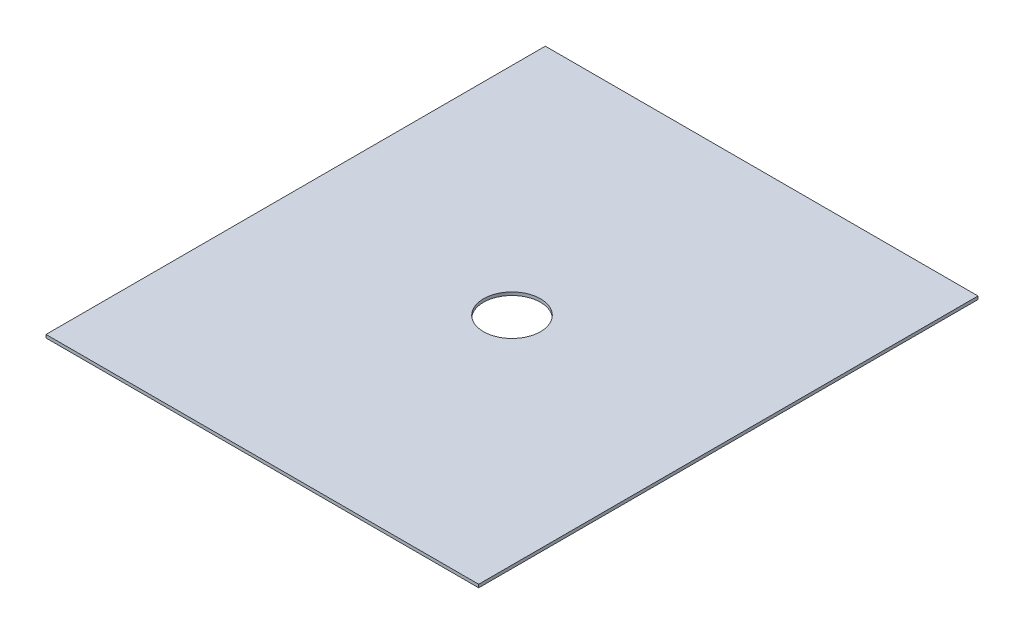
ISO-10303-21;
HEADER;
FILE_DESCRIPTION(('STEP AP214'),'2;1');
FILE_NAME('part.step','',(''),(''),'','','');
FILE_SCHEMA(('AUTOMOTIVE_DESIGN { 1 0 10303 214 1 1 1 1 }'));
ENDSEC;
DATA;
#1=APPLICATION_CONTEXT('core data for automotive mechanical design processes');
#2=APPLICATION_PROTOCOL_DEFINITION('international standard','automotive_design',2000,#1);
#3=PRODUCT_CONTEXT('',#1,'mechanical');
#4=PRODUCT('Part','Part','',(#3));
#5=PRODUCT_RELATED_PRODUCT_CATEGORY('part','',(#4));
#6=PRODUCT_DEFINITION_FORMATION('','',#4);
#7=PRODUCT_DEFINITION_CONTEXT('part definition',#1,'design');
#8=PRODUCT_DEFINITION('design','',#6,#7);
#9=PRODUCT_DEFINITION_SHAPE('','',#8);
#10=(LENGTH_UNIT() NAMED_UNIT(*) SI_UNIT(.MILLI.,.METRE.));
#11=(NAMED_UNIT(*) PLANE_ANGLE_UNIT() SI_UNIT($,.RADIAN.));
#12=(NAMED_UNIT(*) SI_UNIT($,.STERADIAN.) SOLID_ANGLE_UNIT());
#13=UNCERTAINTY_MEASURE_WITH_UNIT(LENGTH_MEASURE(1.E-05),#10,'distance_accuracy_value','');
#14=(GEOMETRIC_REPRESENTATION_CONTEXT(3) GLOBAL_UNCERTAINTY_ASSIGNED_CONTEXT((#13)) GLOBAL_UNIT_ASSIGNED_CONTEXT((#10,
#11,#12)) REPRESENTATION_CONTEXT('',''));
#15=CARTESIAN_POINT('',(0.,0.,0.));
#16=DIRECTION('',(0.,0.,1.));
#17=DIRECTION('',(1.,0.,0.));
#18=AXIS2_PLACEMENT_3D('',#15,#16,#17);
#19=CARTESIAN_POINT('',(138.65,2.,-160.));
#20=DIRECTION('',(-1.,0.,0.));
#21=DIRECTION('',(0.,0.,1.));
#22=AXIS2_PLACEMENT_3D('',#19,#20,#21);
#23=PLANE('',#22);
#24=DIRECTION('',(0.,0.,-1.));
#25=VECTOR('',#24,1.);
#26=CARTESIAN_POINT('',(138.65,0.,-160.));
#27=LINE('',#26,#25);
#28=CARTESIAN_POINT('',(138.65,0.,160.));
#29=VERTEX_POINT('',#28);
#30=CARTESIAN_POINT('',(138.65,0.,-160.));
#31=VERTEX_POINT('',#30);
#32=EDGE_CURVE('E108',#29,#31,#27,.T.);
#33=ORIENTED_EDGE('',*,*,#32,.T.);
#34=DIRECTION('',(0.,-1.,0.));
#35=VECTOR('',#34,1.);
#36=CARTESIAN_POINT('',(138.65,2.,-160.));
#37=LINE('',#36,#35);
#38=CARTESIAN_POINT('',(138.65,2.,-160.));
#39=VERTEX_POINT('',#38);
#40=EDGE_CURVE('E11',#39,#31,#37,.T.);
#41=ORIENTED_EDGE('',*,*,#40,.F.);
#42=DIRECTION('',(0.,0.,-1.));
#43=VECTOR('',#42,1.);
#44=CARTESIAN_POINT('',(138.65,2.,-160.));
#45=LINE('',#44,#43);
#46=CARTESIAN_POINT('',(138.65,2.,160.));
#47=VERTEX_POINT('',#46);
#48=EDGE_CURVE('E91',#47,#39,#45,.T.);
#49=ORIENTED_EDGE('',*,*,#48,.F.);
#50=DIRECTION('',(0.,-1.,0.));
#51=VECTOR('',#50,1.);
#52=CARTESIAN_POINT('',(138.65,2.,160.));
#53=LINE('',#52,#51);
#54=EDGE_CURVE('E104',#47,#29,#53,.T.);
#55=ORIENTED_EDGE('',*,*,#54,.T.);
#56=EDGE_LOOP('',(#33,#41,#49,#55));
#57=FACE_BOUND('',#56,.T.);
#58=ADVANCED_FACE('F38',(#57),#23,.F.);
#59=CARTESIAN_POINT('',(-138.65,2.,-160.));
#60=DIRECTION('',(0.,0.,1.));
#61=DIRECTION('',(1.,0.,0.));
#62=AXIS2_PLACEMENT_3D('',#59,#60,#61);
#63=PLANE('',#62);
#64=DIRECTION('',(-1.,0.,0.));
#65=VECTOR('',#64,1.);
#66=CARTESIAN_POINT('',(-138.65,0.,-160.));
#67=LINE('',#66,#65);
#68=CARTESIAN_POINT('',(-138.65,0.,-160.));
#69=VERTEX_POINT('',#68);
#70=EDGE_CURVE('E96',#31,#69,#67,.T.);
#71=ORIENTED_EDGE('',*,*,#70,.T.);
#72=DIRECTION('',(0.,-1.,0.));
#73=VECTOR('',#72,1.);
#74=CARTESIAN_POINT('',(-138.65,2.,-160.));
#75=LINE('',#74,#73);
#76=CARTESIAN_POINT('',(-138.65,2.,-160.));
#77=VERTEX_POINT('',#76);
#78=EDGE_CURVE('E48',#77,#69,#75,.T.);
#79=ORIENTED_EDGE('',*,*,#78,.F.);
#80=DIRECTION('',(-1.,0.,0.));
#81=VECTOR('',#80,1.);
#82=CARTESIAN_POINT('',(-138.65,2.,-160.));
#83=LINE('',#82,#81);
#84=EDGE_CURVE('E86',#39,#77,#83,.T.);
#85=ORIENTED_EDGE('',*,*,#84,.F.);
#86=ORIENTED_EDGE('',*,*,#40,.T.);
#87=EDGE_LOOP('',(#71,#79,#85,#86));
#88=FACE_BOUND('',#87,.T.);
#89=ADVANCED_FACE('F95',(#88),#63,.F.);
#90=CARTESIAN_POINT('',(-138.65,2.,-160.));
#91=DIRECTION('',(1.,0.,0.));
#92=DIRECTION('',(0.,0.,-1.));
#93=AXIS2_PLACEMENT_3D('',#90,#91,#92);
#94=PLANE('',#93);
#95=DIRECTION('',(0.,0.,1.));
#96=VECTOR('',#95,1.);
#97=CARTESIAN_POINT('',(-138.65,0.,-160.));
#98=LINE('',#97,#96);
#99=CARTESIAN_POINT('',(-138.65,0.,160.));
#100=VERTEX_POINT('',#99);
#101=EDGE_CURVE('E73',#69,#100,#98,.T.);
#102=ORIENTED_EDGE('',*,*,#101,.T.);
#103=DIRECTION('',(0.,-1.,0.));
#104=VECTOR('',#103,1.);
#105=CARTESIAN_POINT('',(-138.65,2.,160.));
#106=LINE('',#105,#104);
#107=CARTESIAN_POINT('',(-138.65,2.,160.));
#108=VERTEX_POINT('',#107);
#109=EDGE_CURVE('E98',#108,#100,#106,.T.);
#110=ORIENTED_EDGE('',*,*,#109,.F.);
#111=DIRECTION('',(0.,0.,1.));
#112=VECTOR('',#111,1.);
#113=CARTESIAN_POINT('',(-138.65,2.,-160.));
#114=LINE('',#113,#112);
#115=EDGE_CURVE('E89',#77,#108,#114,.T.);
#116=ORIENTED_EDGE('',*,*,#115,.F.);
#117=ORIENTED_EDGE('',*,*,#78,.T.);
#118=EDGE_LOOP('',(#102,#110,#116,#117));
#119=FACE_BOUND('',#118,.T.);
#120=ADVANCED_FACE('F100',(#119),#94,.F.);
#121=CARTESIAN_POINT('',(-138.65,2.,160.));
#122=DIRECTION('',(0.,0.,-1.));
#123=DIRECTION('',(-1.,0.,0.));
#124=AXIS2_PLACEMENT_3D('',#121,#122,#123);
#125=PLANE('',#124);
#126=DIRECTION('',(1.,0.,0.));
#127=VECTOR('',#126,1.);
#128=CARTESIAN_POINT('',(-138.65,0.,160.));
#129=LINE('',#128,#127);
#130=EDGE_CURVE('E79',#100,#29,#129,.T.);
#131=ORIENTED_EDGE('',*,*,#130,.T.);
#132=ORIENTED_EDGE('',*,*,#54,.F.);
#133=DIRECTION('',(1.,0.,0.));
#134=VECTOR('',#133,1.);
#135=CARTESIAN_POINT('',(-138.65,2.,160.));
#136=LINE('',#135,#134);
#137=EDGE_CURVE('E56',#108,#47,#136,.T.);
#138=ORIENTED_EDGE('',*,*,#137,.F.);
#139=ORIENTED_EDGE('',*,*,#109,.T.);
#140=EDGE_LOOP('',(#131,#132,#138,#139));
#141=FACE_BOUND('',#140,.T.);
#142=ADVANCED_FACE('F121',(#141),#125,.F.);
#143=CARTESIAN_POINT('',(0.,2.,0.));
#144=DIRECTION('',(0.,1.,0.));
#145=DIRECTION('',(0.,0.,1.));
#146=AXIS2_PLACEMENT_3D('',#143,#144,#145);
#147=PLANE('',#146);
#148=CARTESIAN_POINT('',(0.,2.,0.));
#149=DIRECTION('',(0.,1.,0.));
#150=DIRECTION('',(0.,0.,1.));
#151=AXIS2_PLACEMENT_3D('',#148,#149,#150);
#152=CIRCLE('',#151,18.2814663488821);
#153=CARTESIAN_POINT('',(0.,2.,18.2814663488821));
#154=VERTEX_POINT('',#153);
#155=EDGE_CURVE('E128',#154,#154,#152,.T.);
#156=ORIENTED_EDGE('',*,*,#155,.F.);
#157=EDGE_LOOP('',(#156));
#158=FACE_BOUND('',#157,.T.);
#159=ORIENTED_EDGE('',*,*,#48,.T.);
#160=ORIENTED_EDGE('',*,*,#84,.T.);
#161=ORIENTED_EDGE('',*,*,#115,.T.);
#162=ORIENTED_EDGE('',*,*,#137,.T.);
#163=EDGE_LOOP('',(#159,#160,#161,#162));
#164=FACE_BOUND('',#163,.T.);
#165=ADVANCED_FACE('F87',(#158,#164),#147,.T.);
#166=CARTESIAN_POINT('',(0.,0.,0.));
#167=DIRECTION('',(0.,1.,0.));
#168=DIRECTION('',(0.,0.,1.));
#169=AXIS2_PLACEMENT_3D('',#166,#167,#168);
#170=PLANE('',#169);
#171=CARTESIAN_POINT('',(0.,0.,0.));
#172=DIRECTION('',(0.,1.,0.));
#173=DIRECTION('',(0.,0.,1.));
#174=AXIS2_PLACEMENT_3D('',#171,#172,#173);
#175=CIRCLE('',#174,18.2814663488821);
#176=CARTESIAN_POINT('',(0.,0.,18.2814663488821));
#177=VERTEX_POINT('',#176);
#178=EDGE_CURVE('E41',#177,#177,#175,.T.);
#179=ORIENTED_EDGE('',*,*,#178,.T.);
#180=EDGE_LOOP('',(#179));
#181=FACE_BOUND('',#180,.T.);
#182=ORIENTED_EDGE('',*,*,#32,.F.);
#183=ORIENTED_EDGE('',*,*,#130,.F.);
#184=ORIENTED_EDGE('',*,*,#101,.F.);
#185=ORIENTED_EDGE('',*,*,#70,.F.);
#186=EDGE_LOOP('',(#182,#183,#184,#185));
#187=FACE_BOUND('',#186,.T.);
#188=ADVANCED_FACE('F124',(#181,#187),#170,.F.);
#189=CARTESIAN_POINT('',(0.,-8.,0.));
#190=DIRECTION('',(0.,1.,0.));
#191=DIRECTION('',(0.,0.,1.));
#192=AXIS2_PLACEMENT_3D('',#189,#190,#191);
#193=CYLINDRICAL_SURFACE('',#192,18.2814663488821);
#194=ORIENTED_EDGE('',*,*,#155,.T.);
#195=EDGE_LOOP('',(#194));
#196=FACE_BOUND('',#195,.T.);
#197=ORIENTED_EDGE('',*,*,#178,.F.);
#198=EDGE_LOOP('',(#197));
#199=FACE_BOUND('',#198,.T.);
#200=ADVANCED_FACE('F138',(#196,#199),#193,.F.);
#201=CLOSED_SHELL('',(#58,#89,#120,#142,#165,#188,#200));
#202=MANIFOLD_SOLID_BREP('B2',#201);
#203=ADVANCED_BREP_SHAPE_REPRESENTATION('',(#18,#202),#14);
#204=SHAPE_DEFINITION_REPRESENTATION(#9,#203);
ENDSEC;
END-ISO-10303-21;
